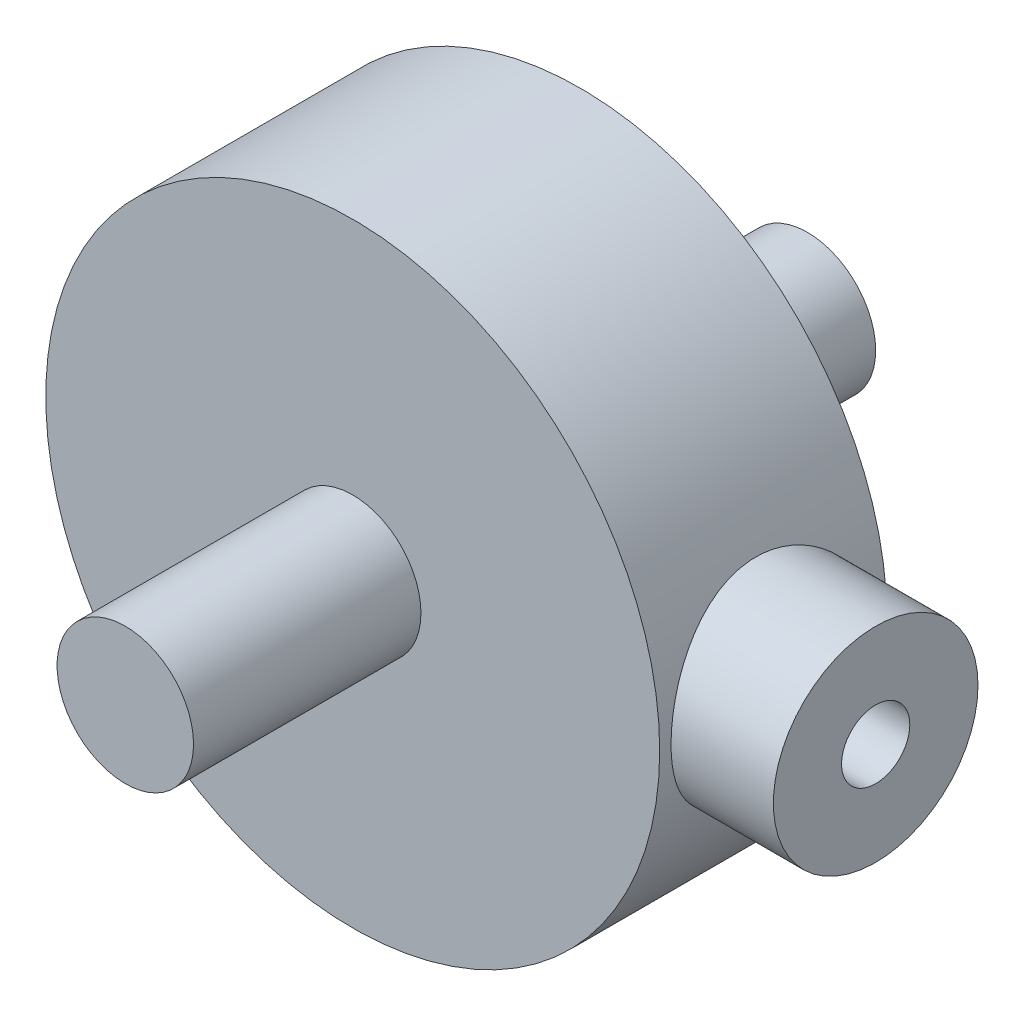
ISO-10303-21;
HEADER;
FILE_DESCRIPTION(('STEP AP214'),'2;1');
FILE_NAME('part.step','',(''),(''),'','','');
FILE_SCHEMA(('AUTOMOTIVE_DESIGN { 1 0 10303 214 1 1 1 1 }'));
ENDSEC;
DATA;
#1=APPLICATION_CONTEXT('core data for automotive mechanical design processes');
#2=APPLICATION_PROTOCOL_DEFINITION('international standard','automotive_design',2000,#1);
#3=PRODUCT_CONTEXT('',#1,'mechanical');
#4=PRODUCT('Part','Part','',(#3));
#5=PRODUCT_RELATED_PRODUCT_CATEGORY('part','',(#4));
#6=PRODUCT_DEFINITION_FORMATION('','',#4);
#7=PRODUCT_DEFINITION_CONTEXT('part definition',#1,'design');
#8=PRODUCT_DEFINITION('design','',#6,#7);
#9=PRODUCT_DEFINITION_SHAPE('','',#8);
#10=(LENGTH_UNIT() NAMED_UNIT(*) SI_UNIT(.MILLI.,.METRE.));
#11=(NAMED_UNIT(*) PLANE_ANGLE_UNIT() SI_UNIT($,.RADIAN.));
#12=(NAMED_UNIT(*) SI_UNIT($,.STERADIAN.) SOLID_ANGLE_UNIT());
#13=UNCERTAINTY_MEASURE_WITH_UNIT(LENGTH_MEASURE(1.E-05),#10,'distance_accuracy_value','');
#14=(GEOMETRIC_REPRESENTATION_CONTEXT(3) GLOBAL_UNCERTAINTY_ASSIGNED_CONTEXT((#13)) GLOBAL_UNIT_ASSIGNED_CONTEXT((#10,
#11,#12)) REPRESENTATION_CONTEXT('',''));
#15=CARTESIAN_POINT('',(0.,0.,0.));
#16=DIRECTION('',(0.,0.,1.));
#17=DIRECTION('',(1.,0.,0.));
#18=AXIS2_PLACEMENT_3D('',#15,#16,#17);
#19=CARTESIAN_POINT('',(0.,0.,-8.33));
#20=DIRECTION('',(0.,0.,1.));
#21=DIRECTION('',(1.,0.,0.));
#22=AXIS2_PLACEMENT_3D('',#19,#20,#21);
#23=CYLINDRICAL_SURFACE('',#22,22.5);
#24=CARTESIAN_POINT('',(0.,0.,8.33));
#25=DIRECTION('',(0.,0.,1.));
#26=DIRECTION('',(1.,0.,0.));
#27=AXIS2_PLACEMENT_3D('',#24,#25,#26);
#28=CIRCLE('',#27,22.5);
#29=CARTESIAN_POINT('',(22.5,0.,8.33));
#30=VERTEX_POINT('',#29);
#31=EDGE_CURVE('E41',#30,#30,#28,.T.);
#32=ORIENTED_EDGE('',*,*,#31,.F.);
#33=EDGE_LOOP('',(#32));
#34=FACE_BOUND('',#33,.T.);
#35=CARTESIAN_POINT('',(0.,0.,-8.33));
#36=DIRECTION('',(0.,0.,1.));
#37=DIRECTION('',(1.,0.,0.));
#38=AXIS2_PLACEMENT_3D('',#35,#36,#37);
#39=CIRCLE('',#38,22.5);
#40=CARTESIAN_POINT('',(22.5,0.,-8.33));
#41=VERTEX_POINT('',#40);
#42=EDGE_CURVE('E37',#41,#41,#39,.T.);
#43=ORIENTED_EDGE('',*,*,#42,.T.);
#44=EDGE_LOOP('',(#43));
#45=FACE_BOUND('',#44,.T.);
#46=CARTESIAN_POINT('',(22.5,0.,-7.5));
#47=CARTESIAN_POINT('',(22.5000000506841,-0.204613077762321,-7.50000007256462));
#48=CARTESIAN_POINT('',(22.4972024966102,-0.40922496039194,-7.49161995266239));
#49=CARTESIAN_POINT('',(22.4860894129534,-0.816927142322308,-7.45818108350542));
#50=CARTESIAN_POINT('',(22.4777739282141,-1.02001745397513,-7.43312246979491));
#51=CARTESIAN_POINT('',(22.455853052945,-1.42317028641601,-7.36656785355631));
#52=CARTESIAN_POINT('',(22.4422482547447,-1.62323314363147,-7.32507369157133));
#53=CARTESIAN_POINT('',(22.4101103580451,-2.01900886970336,-7.22601125517778));
#54=CARTESIAN_POINT('',(22.3915753584914,-2.21472002896191,-7.16843677987337));
#55=CARTESIAN_POINT('',(22.350112036632,-2.59998757037028,-7.03785024273845));
#56=CARTESIAN_POINT('',(22.3271929911311,-2.78955597758619,-6.96487074534033));
#57=CARTESIAN_POINT('',(22.2775348477552,-3.1617677807689,-6.8039979649587));
#58=CARTESIAN_POINT('',(22.2507943122033,-3.34440853762363,-6.71609906682395));
#59=CARTESIAN_POINT('',(22.1658560444318,-3.88009121451468,-6.43103871663408));
#60=CARTESIAN_POINT('',(22.1029044937411,-4.22122248554394,-6.21240137487194));
#61=CARTESIAN_POINT('',(21.9685414152526,-4.87315917917558,-5.71623570922889));
#62=CARTESIAN_POINT('',(21.8969271343477,-5.18268543732151,-5.43708200437581));
#63=CARTESIAN_POINT('',(21.7901214594089,-5.60911767401832,-4.98307893123095));
#64=CARTESIAN_POINT('',(21.7546002289919,-5.74502516162951,-4.82575666632645));
#65=CARTESIAN_POINT('',(21.684716029367,-6.00341316139119,-4.5002390986632));
#66=CARTESIAN_POINT('',(21.6503526372832,-6.12589861328969,-4.33204783252707));
#67=CARTESIAN_POINT('',(21.5827606940486,-6.36001044322164,-3.98072022529268));
#68=CARTESIAN_POINT('',(21.5495946507352,-6.47121489396477,-3.79729077914688));
#69=CARTESIAN_POINT('',(21.4865154501545,-6.67767203183638,-3.42121132477275));
#70=CARTESIAN_POINT('',(21.4566010886616,-6.77293063144606,-3.22856476832975));
#71=CARTESIAN_POINT('',(21.4009588929942,-6.94674693102455,-2.83529931177255));
#72=CARTESIAN_POINT('',(21.3752308887095,-7.02530530963702,-2.63468073600915));
#73=CARTESIAN_POINT('',(21.3288087013041,-7.16500838303226,-2.2269030907116));
#74=CARTESIAN_POINT('',(21.3081142916388,-7.22615386153011,-2.01974431600328));
#75=CARTESIAN_POINT('',(21.2730669962418,-7.32867363502884,-1.60752040826037));
#76=CARTESIAN_POINT('',(21.2585239960433,-7.37064448410385,-1.4026197659074));
#77=CARTESIAN_POINT('',(21.2352782670024,-7.43735231661009,-0.98970770969183));
#78=CARTESIAN_POINT('',(21.2265752716804,-7.46209008638901,-0.781696438210131));
#79=CARTESIAN_POINT('',(21.2153041115834,-7.494075010848,-0.364220481414694));
#80=CARTESIAN_POINT('',(21.2127343839583,-7.50132662127286,-0.154756180001737));
#81=CARTESIAN_POINT('',(21.213813198323,-7.49827538191902,0.264025324860819));
#82=CARTESIAN_POINT('',(21.217461564851,-7.48797302747714,0.473342532294372));
#83=CARTESIAN_POINT('',(21.230542738567,-7.45079975699162,0.880599708590501));
#84=CARTESIAN_POINT('',(21.2397020831184,-7.42471181693124,1.07862055437799));
#85=CARTESIAN_POINT('',(21.2632883804649,-7.3568916704934,1.47171243258234));
#86=CARTESIAN_POINT('',(21.2777170739559,-7.3151542943025,1.6667824680158));
#87=CARTESIAN_POINT('',(21.311404742062,-7.21642177105307,2.052531589504));
#88=CARTESIAN_POINT('',(21.3306623778257,-7.15943085282999,2.2432118766685));
#89=CARTESIAN_POINT('',(21.3734582733637,-7.03063889369708,2.61908393868972));
#90=CARTESIAN_POINT('',(21.396998158419,-6.95883222823843,2.8042735984961));
#91=CARTESIAN_POINT('',(21.4480921279174,-6.79973746203742,3.17082220075978));
#92=CARTESIAN_POINT('',(21.4757034889101,-6.71222377635495,3.35207518865122));
#93=CARTESIAN_POINT('',(21.5338967103533,-6.52311870887617,3.70665765124744));
#94=CARTESIAN_POINT('',(21.564479584649,-6.42152251721553,3.87998439173691));
#95=CARTESIAN_POINT('',(21.6277886118132,-6.20495632928131,4.21767156164956));
#96=CARTESIAN_POINT('',(21.6605149113853,-6.08998541717586,4.38203137593055));
#97=CARTESIAN_POINT('',(21.727258891642,-5.84739639041771,4.70085999080747));
#98=CARTESIAN_POINT('',(21.7612766179642,-5.71977782855307,4.85532844133364));
#99=CARTESIAN_POINT('',(21.8315384602037,-5.44563865208012,5.16133690584327));
#100=CARTESIAN_POINT('',(21.8678057863959,-5.2984777818795,5.31229865103139));
#101=CARTESIAN_POINT('',(21.9398072056805,-4.99195680288638,5.60131468553496));
#102=CARTESIAN_POINT('',(21.9755414632039,-4.83260055293408,5.73937302726039));
#103=CARTESIAN_POINT('',(22.0455330550881,-4.50254798682207,6.00179393983468));
#104=CARTESIAN_POINT('',(22.0797896786712,-4.33184631137312,6.12614996327579));
#105=CARTESIAN_POINT('',(22.1458611870995,-3.98030175689918,6.36017033130459));
#106=CARTESIAN_POINT('',(22.1776770356781,-3.79946292982397,6.46984048745188));
#107=CARTESIAN_POINT('',(22.2383220896213,-3.42681033851341,6.67477740018414));
#108=CARTESIAN_POINT('',(22.2671168588888,-3.23490212541634,6.769882802215));
#109=CARTESIAN_POINT('',(22.3205077165211,-2.84323366887893,6.94347802855124));
#110=CARTESIAN_POINT('',(22.3451054315744,-2.64347650462442,7.02197429304817));
#111=CARTESIAN_POINT('',(22.3894019552152,-2.23749152638802,7.16168359500119));
#112=CARTESIAN_POINT('',(22.4091011623909,-2.0312642404142,7.22289803872173));
#113=CARTESIAN_POINT('',(22.4430209819436,-1.61388858913565,7.32745799986904));
#114=CARTESIAN_POINT('',(22.4572418464706,-1.40274045079605,7.37080433971221));
#115=CARTESIAN_POINT('',(22.4792909948888,-0.986422786129599,7.43770625502071));
#116=CARTESIAN_POINT('',(22.4873697462487,-0.781391056410366,7.46203853036819));
#117=CARTESIAN_POINT('',(22.4979009564752,-0.369877723285791,7.49371555283107));
#118=CARTESIAN_POINT('',(22.5003535911947,-0.163396165399387,7.50106083090094));
#119=CARTESIAN_POINT('',(22.4995641738852,0.249426023123147,7.49869246254063));
#120=CARTESIAN_POINT('',(22.4963229731603,0.455766670213029,7.48898136626491));
#121=CARTESIAN_POINT('',(22.4842380636829,0.866779665784417,7.45260058442439));
#122=CARTESIAN_POINT('',(22.4753944115075,1.07145203109218,7.42593107011672));
#123=CARTESIAN_POINT('',(22.4526875872879,1.47167255643337,7.35691551971597));
#124=CARTESIAN_POINT('',(22.4389785315601,1.66731262840821,7.3150499958732));
#125=CARTESIAN_POINT('',(22.4068617939966,2.05432753422733,7.21593051145712));
#126=CARTESIAN_POINT('',(22.3884525483356,2.24570092539406,7.15867142887414));
#127=CARTESIAN_POINT('',(22.3474116025821,2.6228161681619,7.02926504241342));
#128=CARTESIAN_POINT('',(22.3247810356503,2.80855951555871,6.95712173346947));
#129=CARTESIAN_POINT('',(22.2758507045439,3.17338401350261,6.79847173328387));
#130=CARTESIAN_POINT('',(22.2495495534914,3.35246261332282,6.71195961063088));
#131=CARTESIAN_POINT('',(22.1932086123396,3.70737221896236,6.52279609699609));
#132=CARTESIAN_POINT('',(22.1630895502991,3.88299853986655,6.4197843186999));
#133=CARTESIAN_POINT('',(22.1004330335683,4.22505723672854,6.20001883073102));
#134=CARTESIAN_POINT('',(22.0678947463969,4.39148641318667,6.08326038254264));
#135=CARTESIAN_POINT('',(22.0012275699816,4.71414142189704,5.83678750872483));
#136=CARTESIAN_POINT('',(21.967098527605,4.87036626834807,5.70707183440007));
#137=CARTESIAN_POINT('',(21.8981131563659,5.17170542642041,5.4354950187662));
#138=CARTESIAN_POINT('',(21.8632568084865,5.31681944705966,5.29363355957635));
#139=CARTESIAN_POINT('',(21.7921123146564,5.60145834189174,4.99185600876954));
#140=CARTESIAN_POINT('',(21.7558314944371,5.74042513392051,4.83141120771116));
#141=CARTESIAN_POINT('',(21.684478948203,6.00433661963008,4.49921424595711));
#142=CARTESIAN_POINT('',(21.649406824947,6.1292859512249,4.32746585526476));
#143=CARTESIAN_POINT('',(21.5814595926728,6.36440000595555,3.97360703981365));
#144=CARTESIAN_POINT('',(21.5485854100643,6.47455851438786,3.79149230487626));
#145=CARTESIAN_POINT('',(21.4860488176536,6.67915795236131,3.41820554745645));
#146=CARTESIAN_POINT('',(21.456385071755,6.77360542926348,3.22703734077171));
#147=CARTESIAN_POINT('',(21.4012208599072,6.94592859364738,2.83715150146813));
#148=CARTESIAN_POINT('',(21.3757139208143,7.02383010567182,2.63844621250781));
#149=CARTESIAN_POINT('',(21.329641046742,7.1625245035684,2.23467834068868));
#150=CARTESIAN_POINT('',(21.309073113354,7.22332431080344,2.02961836709483));
#151=CARTESIAN_POINT('',(21.2735584315631,7.32725955061045,1.61462494171556));
#152=CARTESIAN_POINT('',(21.2586107096978,7.37039804236896,1.40469234059979));
#153=CARTESIAN_POINT('',(21.2348504287856,7.43857763041788,0.981568232647435));
#154=CARTESIAN_POINT('',(21.226037560555,7.46361963873537,0.768376890598019));
#155=CARTESIAN_POINT('',(21.2151447060251,7.49452360046792,0.351476664023221));
#156=CARTESIAN_POINT('',(21.212741807065,7.50130560715786,0.147843892668517));
#157=CARTESIAN_POINT('',(21.213811415552,7.49828044273967,-0.259281461983097));
#158=CARTESIAN_POINT('',(21.2172837958381,7.48847363066983,-0.462774048218726));
#159=CARTESIAN_POINT('',(21.2299917753085,7.45236960482119,-0.868091614565073));
#160=CARTESIAN_POINT('',(21.2392269742255,7.42607353633382,-1.06991670950811));
#161=CARTESIAN_POINT('',(21.2631664785622,7.35724648278176,-1.47044728260539));
#162=CARTESIAN_POINT('',(21.2778708014677,7.31471544581088,-1.66915275078349));
#163=CARTESIAN_POINT('',(21.3119595777875,7.21478384233387,-2.05826800778521));
#164=CARTESIAN_POINT('',(21.3312485803829,7.15768498972315,-2.24876384443822));
#165=CARTESIAN_POINT('',(21.3740944720634,7.02870548761453,-2.62425628990407));
#166=CARTESIAN_POINT('',(21.3976527834732,6.95681991082296,-2.80925104204302));
#167=CARTESIAN_POINT('',(21.4483686679195,6.79884967983659,-3.17251743511395));
#168=CARTESIAN_POINT('',(21.4755255942843,6.71276757608221,-3.3507902765983));
#169=CARTESIAN_POINT('',(21.5327201735427,6.52697547183444,-3.69968517069464));
#170=CARTESIAN_POINT('',(21.562758917431,6.42726030403155,-3.87030428961037));
#171=CARTESIAN_POINT('',(21.6262744863681,6.21027965546024,-4.21008286798429));
#172=CARTESIAN_POINT('',(21.6598438550383,6.09244126451787,-4.37885934756131));
#173=CARTESIAN_POINT('',(21.7283515193311,5.84340818815656,-4.70604559690831));
#174=CARTESIAN_POINT('',(21.7632902894805,5.71220884725602,-4.86445172143531));
#175=CARTESIAN_POINT('',(21.8335983383062,5.4372889878888,-5.16992409494239));
#176=CARTESIAN_POINT('',(21.8689676587229,5.29356724696198,-5.31698923414656));
#177=CARTESIAN_POINT('',(21.9392078773617,4.99447222623498,-5.59888195408062));
#178=CARTESIAN_POINT('',(21.9740787715487,4.83909885216758,-5.73370943578256));
#179=CARTESIAN_POINT('',(22.0437605404542,4.51129489683467,-5.99532298818562));
#180=CARTESIAN_POINT('',(22.078515345823,4.33843419510244,-6.12158577132384));
#181=CARTESIAN_POINT('',(22.1455251731374,3.9822773241616,-6.35902959088365));
#182=CARTESIAN_POINT('',(22.1777810805816,3.79898489180338,-6.47021598028618));
#183=CARTESIAN_POINT('',(22.2389034247268,3.42307420530595,-6.67671759382446));
#184=CARTESIAN_POINT('',(22.2677692068596,3.23045416029014,-6.77202975443143));
#185=CARTESIAN_POINT('',(22.3212653673203,2.83732927027781,-6.94591485302136));
#186=CARTESIAN_POINT('',(22.3458976381694,2.63682799796538,-7.02449527442401));
#187=CARTESIAN_POINT('',(22.3892421179782,2.23834924567062,-7.16115725510654));
#188=CARTESIAN_POINT('',(22.4081682364488,2.04065340817802,-7.21999266937531));
#189=CARTESIAN_POINT('',(22.4409913463104,1.64077087243283,-7.32122857496937));
#190=CARTESIAN_POINT('',(22.4548904685105,1.4385861155761,-7.36363603020924));
#191=CARTESIAN_POINT('',(22.477286789585,1.03111970945381,-7.43165217716353));
#192=CARTESIAN_POINT('',(22.4857841786884,0.82583816950613,-7.45726146044827));
#193=CARTESIAN_POINT('',(22.4971407505117,0.413704009678497,-7.49143531171324));
#194=CARTESIAN_POINT('',(22.4999999487615,0.206851394127518,-7.49999992664157));
#195=CARTESIAN_POINT('',(22.5,0.,-7.5));
#196=B_SPLINE_CURVE_WITH_KNOTS('',3,(#46,#47,#48,#49,#50,#51,#52,#53,#54,#55,#56,#57,#58,#59,
#60,#61,#62,#63,#64,#65,#66,#67,#68,#69,#70,#71,#72,#73,#74,#75,#76,#77,#78,#79,#80,#81,#82,#83,
#84,#85,#86,#87,#88,#89,#90,#91,#92,#93,#94,#95,#96,#97,#98,#99,#100,#101,#102,#103,#104,#105,
#106,#107,#108,#109,#110,#111,#112,#113,#114,#115,#116,#117,#118,#119,#120,#121,#122,#123,#124,
#125,#126,#127,#128,#129,#130,#131,#132,#133,#134,#135,#136,#137,#138,#139,#140,#141,#142,#143,
#144,#145,#146,#147,#148,#149,#150,#151,#152,#153,#154,#155,#156,#157,#158,#159,#160,#161,#162,
#163,#164,#165,#166,#167,#168,#169,#170,#171,#172,#173,#174,#175,#176,#177,#178,#179,#180,#181,
#182,#183,#184,#185,#186,#187,#188,#189,#190,#191,#192,#193,#194,#195),.UNSPECIFIED.,.T.,.F.,(4,
2,2,2,2,2,2,2,2,2,2,2,2,2,2,2,2,2,2,2,2,2,2,2,2,2,2,2,2,2,2,2,2,2,2,2,2,2,2,2,2,2,2,2,2,2,2,2,2,
2,2,2,2,2,2,2,2,2,2,2,2,2,2,2,2,2,2,2,2,2,2,2,2,2,4),(0.,0.613647324005627,1.22728966102992,
1.84086329842972,2.45467386976084,3.06719968270601,3.67995654264799,4.90443432961419,
6.16713781732763,6.79927862592974,7.43118599909674,8.08155932057237,8.73169095669613,
9.38179616849325,10.0318721159051,10.6600526530525,11.288204524361,11.9161963159014,
12.5441703870979,13.1432927009573,13.7426131103529,14.3417675381769,14.9411498447841,
15.5499526973971,16.1589640006794,16.7680170304887,17.377091603671,18.0181035164514,
18.6589134334034,19.3000282340667,19.9408885752985,20.5884022348778,21.2356643591189,
21.8828737988509,22.5300534461042,23.1491686653433,23.7682645329318,24.3872678453462,
25.0062649067618,25.6071865960013,26.2083084822463,26.8092692364818,27.4104576730355,
28.0272382175191,28.6442319939005,29.2612852877976,29.8783547362163,30.5236108032855,
31.1686527428554,31.8139648690612,32.4590073927198,33.1030356286492,33.7468028386711,
34.3904584919942,35.034081704079,35.6446087899115,36.2551226620366,36.8655941345018,
37.4760675587734,38.0747999085375,38.6737320945285,39.2725567978817,39.8716091049119,
40.496596116503,41.1218016481915,41.7470682821452,42.3723399753478,43.0221519717048,
43.6717326401429,44.3214385246761,44.9708532092089,45.5915003253758,46.2118840566931,
46.8322459391856,47.4526061129407),.UNSPECIFIED.);
#197=CARTESIAN_POINT('',(22.5,0.,-7.5));
#198=VERTEX_POINT('',#197);
#199=EDGE_CURVE('E46',#198,#198,#196,.T.);
#200=ORIENTED_EDGE('',*,*,#199,.T.);
#201=EDGE_LOOP('',(#200));
#202=FACE_BOUND('',#201,.T.);
#203=ADVANCED_FACE('F30',(#34,#45,#202),#23,.T.);
#204=CARTESIAN_POINT('',(0.,0.,-8.33));
#205=DIRECTION('',(0.,0.,1.));
#206=DIRECTION('',(1.,0.,0.));
#207=AXIS2_PLACEMENT_3D('',#204,#205,#206);
#208=PLANE('',#207);
#209=CARTESIAN_POINT('',(0.,0.,-8.33));
#210=DIRECTION('',(0.,0.,1.));
#211=DIRECTION('',(1.,0.,0.));
#212=AXIS2_PLACEMENT_3D('',#209,#210,#211);
#213=CIRCLE('',#212,5.);
#214=CARTESIAN_POINT('',(5.,0.,-8.33));
#215=VERTEX_POINT('',#214);
#216=EDGE_CURVE('E76',#215,#215,#213,.T.);
#217=ORIENTED_EDGE('',*,*,#216,.T.);
#218=EDGE_LOOP('',(#217));
#219=FACE_BOUND('',#218,.T.);
#220=ORIENTED_EDGE('',*,*,#42,.F.);
#221=EDGE_LOOP('',(#220));
#222=FACE_BOUND('',#221,.T.);
#223=ADVANCED_FACE('F65',(#219,#222),#208,.F.);
#224=CARTESIAN_POINT('',(0.,0.,8.33));
#225=DIRECTION('',(0.,0.,1.));
#226=DIRECTION('',(1.,0.,0.));
#227=AXIS2_PLACEMENT_3D('',#224,#225,#226);
#228=PLANE('',#227);
#229=CARTESIAN_POINT('',(0.,0.,8.33));
#230=DIRECTION('',(0.,0.,1.));
#231=DIRECTION('',(1.,0.,0.));
#232=AXIS2_PLACEMENT_3D('',#229,#230,#231);
#233=CIRCLE('',#232,5.);
#234=CARTESIAN_POINT('',(5.,0.,8.33));
#235=VERTEX_POINT('',#234);
#236=EDGE_CURVE('E10',#235,#235,#233,.T.);
#237=ORIENTED_EDGE('',*,*,#236,.F.);
#238=EDGE_LOOP('',(#237));
#239=FACE_BOUND('',#238,.T.);
#240=ORIENTED_EDGE('',*,*,#31,.T.);
#241=EDGE_LOOP('',(#240));
#242=FACE_BOUND('',#241,.T.);
#243=ADVANCED_FACE('F61',(#239,#242),#228,.T.);
#244=CARTESIAN_POINT('',(30.,0.,0.));
#245=DIRECTION('',(-1.,0.,0.));
#246=DIRECTION('',(0.,0.,1.));
#247=AXIS2_PLACEMENT_3D('',#244,#245,#246);
#248=CYLINDRICAL_SURFACE('',#247,7.5);
#249=ORIENTED_EDGE('',*,*,#199,.F.);
#250=EDGE_LOOP('',(#249));
#251=FACE_BOUND('',#250,.T.);
#252=CARTESIAN_POINT('',(30.,0.,0.));
#253=DIRECTION('',(1.,0.,0.));
#254=DIRECTION('',(0.,0.,-1.));
#255=AXIS2_PLACEMENT_3D('',#252,#253,#254);
#256=CIRCLE('',#255,7.5);
#257=CARTESIAN_POINT('',(30.,0.,-7.5));
#258=VERTEX_POINT('',#257);
#259=EDGE_CURVE('E54',#258,#258,#256,.T.);
#260=ORIENTED_EDGE('',*,*,#259,.F.);
#261=EDGE_LOOP('',(#260));
#262=FACE_BOUND('',#261,.T.);
#263=ADVANCED_FACE('F55',(#251,#262),#248,.T.);
#264=CARTESIAN_POINT('',(30.,0.,0.));
#265=DIRECTION('',(1.,0.,0.));
#266=DIRECTION('',(0.,0.,-1.));
#267=AXIS2_PLACEMENT_3D('',#264,#265,#266);
#268=PLANE('',#267);
#269=CARTESIAN_POINT('',(30.,0.,0.));
#270=DIRECTION('',(1.,0.,0.));
#271=DIRECTION('',(0.,0.,-1.));
#272=AXIS2_PLACEMENT_3D('',#269,#270,#271);
#273=CIRCLE('',#272,2.5);
#274=CARTESIAN_POINT('',(30.,0.,-2.5));
#275=VERTEX_POINT('',#274);
#276=EDGE_CURVE('E78',#275,#275,#273,.T.);
#277=ORIENTED_EDGE('',*,*,#276,.F.);
#278=EDGE_LOOP('',(#277));
#279=FACE_BOUND('',#278,.T.);
#280=ORIENTED_EDGE('',*,*,#259,.T.);
#281=EDGE_LOOP('',(#280));
#282=FACE_BOUND('',#281,.T.);
#283=ADVANCED_FACE('F60',(#279,#282),#268,.T.);
#284=CARTESIAN_POINT('',(20.,0.,0.));
#285=DIRECTION('',(1.,0.,0.));
#286=DIRECTION('',(0.,0.,-1.));
#287=AXIS2_PLACEMENT_3D('',#284,#285,#286);
#288=CYLINDRICAL_SURFACE('',#287,2.5);
#289=CARTESIAN_POINT('',(20.,0.,0.));
#290=DIRECTION('',(1.,0.,0.));
#291=DIRECTION('',(0.,0.,-1.));
#292=AXIS2_PLACEMENT_3D('',#289,#290,#291);
#293=CIRCLE('',#292,2.5);
#294=CARTESIAN_POINT('',(20.,0.,-2.5));
#295=VERTEX_POINT('',#294);
#296=EDGE_CURVE('E82',#295,#295,#293,.T.);
#297=ORIENTED_EDGE('',*,*,#296,.F.);
#298=EDGE_LOOP('',(#297));
#299=FACE_BOUND('',#298,.T.);
#300=ORIENTED_EDGE('',*,*,#276,.T.);
#301=EDGE_LOOP('',(#300));
#302=FACE_BOUND('',#301,.T.);
#303=ADVANCED_FACE('F95',(#299,#302),#288,.F.);
#304=CARTESIAN_POINT('',(20.,0.,0.));
#305=DIRECTION('',(1.,0.,0.));
#306=DIRECTION('',(0.,0.,-1.));
#307=AXIS2_PLACEMENT_3D('',#304,#305,#306);
#308=PLANE('',#307);
#309=ORIENTED_EDGE('',*,*,#296,.T.);
#310=EDGE_LOOP('',(#309));
#311=FACE_BOUND('',#310,.T.);
#312=ADVANCED_FACE('F100',(#311),#308,.T.);
#313=CARTESIAN_POINT('',(0.,0.,25.));
#314=DIRECTION('',(0.,0.,1.));
#315=DIRECTION('',(1.,0.,0.));
#316=AXIS2_PLACEMENT_3D('',#313,#314,#315);
#317=PLANE('',#316);
#318=CARTESIAN_POINT('',(0.,0.,25.));
#319=DIRECTION('',(0.,0.,1.));
#320=DIRECTION('',(1.,0.,0.));
#321=AXIS2_PLACEMENT_3D('',#318,#319,#320);
#322=CIRCLE('',#321,5.);
#323=CARTESIAN_POINT('',(5.,0.,25.));
#324=VERTEX_POINT('',#323);
#325=EDGE_CURVE('E85',#324,#324,#322,.T.);
#326=ORIENTED_EDGE('',*,*,#325,.T.);
#327=EDGE_LOOP('',(#326));
#328=FACE_BOUND('',#327,.T.);
#329=ADVANCED_FACE('F107',(#328),#317,.T.);
#330=CARTESIAN_POINT('',(0.,0.,-25.));
#331=DIRECTION('',(0.,0.,1.));
#332=DIRECTION('',(1.,0.,0.));
#333=AXIS2_PLACEMENT_3D('',#330,#331,#332);
#334=CYLINDRICAL_SURFACE('',#333,5.);
#335=ORIENTED_EDGE('',*,*,#236,.T.);
#336=EDGE_LOOP('',(#335));
#337=FACE_BOUND('',#336,.T.);
#338=ORIENTED_EDGE('',*,*,#325,.F.);
#339=EDGE_LOOP('',(#338));
#340=FACE_BOUND('',#339,.T.);
#341=ADVANCED_FACE('F112',(#337,#340),#334,.T.);
#342=CARTESIAN_POINT('',(0.,0.,-25.));
#343=DIRECTION('',(0.,0.,1.));
#344=DIRECTION('',(1.,0.,0.));
#345=AXIS2_PLACEMENT_3D('',#342,#343,#344);
#346=CIRCLE('',#345,5.);
#347=CARTESIAN_POINT('',(5.,0.,-25.));
#348=VERTEX_POINT('',#347);
#349=EDGE_CURVE('E79',#348,#348,#346,.T.);
#350=ORIENTED_EDGE('',*,*,#349,.T.);
#351=EDGE_LOOP('',(#350));
#352=FACE_BOUND('',#351,.T.);
#353=ORIENTED_EDGE('',*,*,#216,.F.);
#354=EDGE_LOOP('',(#353));
#355=FACE_BOUND('',#354,.T.);
#356=ADVANCED_FACE('F115',(#352,#355),#334,.T.);
#357=CARTESIAN_POINT('',(0.,0.,-25.));
#358=DIRECTION('',(0.,0.,1.));
#359=DIRECTION('',(1.,0.,0.));
#360=AXIS2_PLACEMENT_3D('',#357,#358,#359);
#361=PLANE('',#360);
#362=ORIENTED_EDGE('',*,*,#349,.F.);
#363=EDGE_LOOP('',(#362));
#364=FACE_BOUND('',#363,.T.);
#365=ADVANCED_FACE('F116',(#364),#361,.F.);
#366=CLOSED_SHELL('',(#203,#223,#243,#263,#283,#303,#312,#329,#341,#356,#365));
#367=MANIFOLD_SOLID_BREP('B2',#366);
#368=ADVANCED_BREP_SHAPE_REPRESENTATION('',(#18,#367),#14);
#369=SHAPE_DEFINITION_REPRESENTATION(#9,#368);
ENDSEC;
END-ISO-10303-21;
